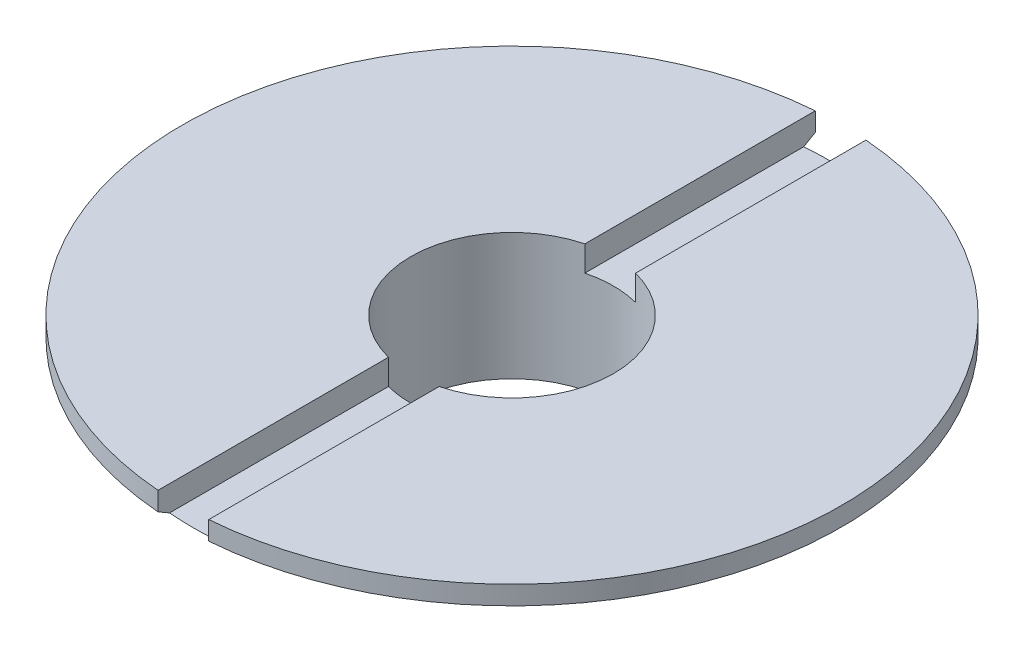
ISO-10303-21;
HEADER;
FILE_DESCRIPTION(('STEP AP214'),'2;1');
FILE_NAME('part.step','',(''),(''),'','','');
FILE_SCHEMA(('AUTOMOTIVE_DESIGN { 1 0 10303 214 1 1 1 1 }'));
ENDSEC;
DATA;
#1=APPLICATION_CONTEXT('core data for automotive mechanical design processes');
#2=APPLICATION_PROTOCOL_DEFINITION('international standard','automotive_design',2000,#1);
#3=PRODUCT_CONTEXT('',#1,'mechanical');
#4=PRODUCT('Part','Part','',(#3));
#5=PRODUCT_RELATED_PRODUCT_CATEGORY('part','',(#4));
#6=PRODUCT_DEFINITION_FORMATION('','',#4);
#7=PRODUCT_DEFINITION_CONTEXT('part definition',#1,'design');
#8=PRODUCT_DEFINITION('design','',#6,#7);
#9=PRODUCT_DEFINITION_SHAPE('','',#8);
#10=(LENGTH_UNIT() NAMED_UNIT(*) SI_UNIT(.MILLI.,.METRE.));
#11=(NAMED_UNIT(*) PLANE_ANGLE_UNIT() SI_UNIT($,.RADIAN.));
#12=(NAMED_UNIT(*) SI_UNIT($,.STERADIAN.) SOLID_ANGLE_UNIT());
#13=UNCERTAINTY_MEASURE_WITH_UNIT(LENGTH_MEASURE(1.E-05),#10,'distance_accuracy_value','');
#14=(GEOMETRIC_REPRESENTATION_CONTEXT(3) GLOBAL_UNCERTAINTY_ASSIGNED_CONTEXT((#13)) GLOBAL_UNIT_ASSIGNED_CONTEXT((#10,
#11,#12)) REPRESENTATION_CONTEXT('',''));
#15=CARTESIAN_POINT('',(0.,0.,0.));
#16=DIRECTION('',(0.,0.,1.));
#17=DIRECTION('',(1.,0.,0.));
#18=AXIS2_PLACEMENT_3D('',#15,#16,#17);
#19=CARTESIAN_POINT('',(0.,1.76121356458863,0.));
#20=DIRECTION('',(0.,1.,0.));
#21=DIRECTION('',(0.,0.,1.));
#22=AXIS2_PLACEMENT_3D('',#19,#20,#21);
#23=CONICAL_SURFACE('',#22,13.,1.0471975511966);
#24=CARTESIAN_POINT('',(0.,-2.5,0.));
#25=DIRECTION('',(0.,1.,0.));
#26=DIRECTION('',(0.,0.,1.));
#27=AXIS2_PLACEMENT_3D('',#24,#25,#26);
#28=CIRCLE('',#27,5.61936160423082);
#29=CARTESIAN_POINT('',(0.,-2.5,5.61936160423082));
#30=VERTEX_POINT('',#29);
#31=EDGE_CURVE('E207',#30,#30,#28,.T.);
#32=ORIENTED_EDGE('',*,*,#31,.T.);
#33=EDGE_LOOP('',(#32));
#34=FACE_BOUND('',#33,.T.);
#35=CARTESIAN_POINT('',(0.,1.76121356458863,0.));
#36=DIRECTION('',(0.,1.,0.));
#37=DIRECTION('',(0.,0.,1.));
#38=AXIS2_PLACEMENT_3D('',#35,#36,#37);
#39=CIRCLE('',#38,13.);
#40=CARTESIAN_POINT('',(-0.999999999999997,1.76121356458863,-12.9614813968157));
#41=VERTEX_POINT('',#40);
#42=CARTESIAN_POINT('',(-0.999999999999997,1.76121356458863,12.9614813968157));
#43=VERTEX_POINT('',#42);
#44=EDGE_CURVE('E129',#41,#43,#39,.T.);
#45=ORIENTED_EDGE('',*,*,#44,.F.);
#46=CARTESIAN_POINT('',(-0.999999999999998,1.76191356458863,-12.9626974351289));
#47=CARTESIAN_POINT('',(-0.999999999999998,1.44654310007895,-12.414807614886));
#48=CARTESIAN_POINT('',(-0.999999999999998,1.1312381940923,-11.866879939586));
#49=CARTESIAN_POINT('',(-0.999999999999998,0.500898113642046,-10.7708640181103));
#50=CARTESIAN_POINT('',(-0.999999999999998,0.185862941215046,-10.2227757707634));
#51=CARTESIAN_POINT('',(-0.999999999999998,-0.44410346208642,-9.12582376043192));
#52=CARTESIAN_POINT('',(-0.999999999999998,-0.759034287167687,-8.57695976439502));
#53=CARTESIAN_POINT('',(-0.999999999999998,-1.38818931101753,-7.47883096105241));
#54=CARTESIAN_POINT('',(-0.999999999999998,-1.70241351414487,-6.92956615624689));
#55=CARTESIAN_POINT('',(-0.999999999999998,-2.17157653462951,-6.10701575677405));
#56=CARTESIAN_POINT('',(-0.999999999999998,-2.32704791066362,-5.83403400401745));
#57=CARTESIAN_POINT('',(-0.999999999999998,-2.63746138525596,-5.28776463786228));
#58=CARTESIAN_POINT('',(-0.999999999999998,-2.79240347676807,-5.01447702045567));
#59=CARTESIAN_POINT('',(-0.999999999999998,-3.10135974518407,-4.46757322698629));
#60=CARTESIAN_POINT('',(-0.999999999999998,-3.25537437987272,-4.19395730958987));
#61=CARTESIAN_POINT('',(-0.999999999999998,-3.56197663448593,-3.6459368107344));
#62=CARTESIAN_POINT('',(-0.999999999999998,-3.71456430605616,-3.37153225829181));
#63=CARTESIAN_POINT('',(-0.999999999999998,-3.94180986880993,-2.9578886951189));
#64=CARTESIAN_POINT('',(-0.999999999999998,-4.01752089110942,-2.81922937173839));
#65=CARTESIAN_POINT('',(-0.999999999999998,-4.1678593257431,-2.54130845518419));
#66=CARTESIAN_POINT('',(-0.999999999999998,-4.24248664458464,-2.40204681137681));
#67=CARTESIAN_POINT('',(-0.999999999999998,-4.39015682099838,-2.12242354390389));
#68=CARTESIAN_POINT('',(-0.999999999999998,-4.46319725349592,-1.98206062943476));
#69=CARTESIAN_POINT('',(-0.999999999999998,-4.57056355858367,-1.77041367874698));
#70=CARTESIAN_POINT('',(-0.999999999999998,-4.60598411971819,-1.6996860889626));
#71=CARTESIAN_POINT('',(-0.999999999999998,-4.67582572921966,-1.55774017512345));
#72=CARTESIAN_POINT('',(-0.999999999999998,-4.71024681009839,-1.48652186712455));
#73=CARTESIAN_POINT('',(-0.999999999999998,-4.77877812281097,-1.3411735748486));
#74=CARTESIAN_POINT('',(-0.999999999999998,-4.81284421110772,-1.26702266489727));
#75=CARTESIAN_POINT('',(-0.999999999999998,-4.8788640014603,-1.11778789583251));
#76=CARTESIAN_POINT('',(-0.999999999999998,-4.91081796930764,-1.04270415552555));
#77=CARTESIAN_POINT('',(-0.999999999999998,-4.97157784464729,-0.891318955786635));
#78=CARTESIAN_POINT('',(-0.999999999999998,-5.00038592357764,-0.815018378498337));
#79=CARTESIAN_POINT('',(-0.999999999999998,-5.05326150855774,-0.660771002910725));
#80=CARTESIAN_POINT('',(-0.999999999999998,-5.07733102251874,-0.5828249174462));
#81=CARTESIAN_POINT('',(-0.999999999999998,-5.1120303985729,-0.44924271365831));
#82=CARTESIAN_POINT('',(-0.999999999999998,-5.12451804328225,-0.394097319444673));
#83=CARTESIAN_POINT('',(-0.999999999999998,-5.1450827387689,-0.283000512325802));
#84=CARTESIAN_POINT('',(-0.999999999999998,-5.15316254432022,-0.227049625326817));
#85=CARTESIAN_POINT('',(-0.999999999999998,-5.16405335239172,-0.114979260207174));
#86=CARTESIAN_POINT('',(-0.999999999999998,-5.16689764152065,-0.058863135235543));
#87=CARTESIAN_POINT('',(-0.999999999999998,-5.16707734656735,0.0533775683846901));
#88=CARTESIAN_POINT('',(-0.999999999999998,-5.16441258186698,0.109502147250135));
#89=CARTESIAN_POINT('',(-0.999999999999998,-5.15228985834141,0.238159640703518));
#90=CARTESIAN_POINT('',(-0.999999999999998,-5.14102057671114,0.310519567636525));
#91=CARTESIAN_POINT('',(-0.999999999999998,-5.11151068170504,0.453803824231379));
#92=CARTESIAN_POINT('',(-0.999999999999998,-5.09326270382424,0.52472655370254));
#93=CARTESIAN_POINT('',(-0.999999999999998,-5.05155846392108,0.666016663517311));
#94=CARTESIAN_POINT('',(-0.999999999999998,-5.0280358236357,0.736363938081781));
#95=CARTESIAN_POINT('',(-0.999999999999998,-4.99015336519638,0.840905149310635));
#96=CARTESIAN_POINT('',(-0.999999999999998,-4.97709495028742,0.875583806236056));
#97=CARTESIAN_POINT('',(-0.999999999999998,-4.95025199633135,0.944658345481751));
#98=CARTESIAN_POINT('',(-0.999999999999998,-4.93646748155324,0.979054237208741));
#99=CARTESIAN_POINT('',(-0.999999999999998,-4.89103335841835,1.08962502872005));
#100=CARTESIAN_POINT('',(-0.999999999999998,-4.85820310833388,1.16531390215794));
#101=CARTESIAN_POINT('',(-0.999999999999998,-4.79055508237912,1.3158018452918));
#102=CARTESIAN_POINT('',(-0.999999999999998,-4.75573696889086,1.39060076121529));
#103=CARTESIAN_POINT('',(-0.999999999999998,-4.68469861279711,1.53957226961997));
#104=CARTESIAN_POINT('',(-0.999999999999998,-4.64847769399958,1.61374453851728));
#105=CARTESIAN_POINT('',(-0.999999999999998,-4.57503758985759,1.76159423012742));
#106=CARTESIAN_POINT('',(-0.999999999999998,-4.53781837090288,1.83527163607476));
#107=CARTESIAN_POINT('',(-0.999999999999998,-4.42496493703241,2.05595962422562));
#108=CARTESIAN_POINT('',(-0.999999999999998,-4.348239495152,2.20241116883192));
#109=CARTESIAN_POINT('',(-0.999999999999998,-4.19313689637219,2.49437426533894));
#110=CARTESIAN_POINT('',(-0.999999999999998,-4.11476023762732,2.63988608391489));
#111=CARTESIAN_POINT('',(-0.999999999999998,-3.95740555537634,2.92946804358907));
#112=CARTESIAN_POINT('',(-0.999999999999998,-3.87843384514201,3.07354161857863));
#113=CARTESIAN_POINT('',(-0.999999999999998,-3.71977518266145,3.36130803884283));
#114=CARTESIAN_POINT('',(-0.999999999999998,-3.64008817600715,3.50500085406013));
#115=CARTESIAN_POINT('',(-0.999999999999998,-3.40043948947353,3.93540796407278));
#116=CARTESIAN_POINT('',(-0.999999999999998,-3.23974580025044,4.22171436895267));
#117=CARTESIAN_POINT('',(-0.999999999999998,-2.87980524727489,4.86029040992734));
#118=CARTESIAN_POINT('',(-0.999999999999998,-2.68028804415844,5.21240726454267));
#119=CARTESIAN_POINT('',(-0.999999999999998,-2.2803810118986,5.91614949498076));
#120=CARTESIAN_POINT('',(-0.999999999999998,-2.07999117381118,6.26777486571706));
#121=CARTESIAN_POINT('',(-0.999999999999998,-1.47790434710308,7.32247977240141));
#122=CARTESIAN_POINT('',(-0.999999999999998,-1.07544114288528,8.02512162427379));
#123=CARTESIAN_POINT('',(-0.999999999999998,-0.26735489041489,9.4338838609302));
#124=CARTESIAN_POINT('',(-0.999999999999998,0.138273137180841,10.1400013855152));
#125=CARTESIAN_POINT('',(-0.999999999999998,0.74700379506642,11.1988245013859));
#126=CARTESIAN_POINT('',(-0.999999999999998,0.949921609001419,11.5516363322112));
#127=CARTESIAN_POINT('',(-0.999999999999998,1.3558527360151,12.2572044890082));
#128=CARTESIAN_POINT('',(-0.999999999999998,1.55886604897889,12.609960815046));
#129=CARTESIAN_POINT('',(-0.999999999999998,1.76191356458863,12.9626974351289));
#130=B_SPLINE_CURVE_WITH_KNOTS('',3,(#46,#47,#48,#49,#50,#51,#52,#53,#54,#55,#56,#57,#58,#59,
#60,#61,#62,#63,#64,#65,#66,#67,#68,#69,#70,#71,#72,#73,#74,#75,#76,#77,#78,#79,#80,#81,#82,#83,
#84,#85,#86,#87,#88,#89,#90,#91,#92,#93,#94,#95,#96,#97,#98,#99,#100,#101,#102,#103,#104,#105,
#106,#107,#108,#109,#110,#111,#112,#113,#114,#115,#116,#117,#118,#119,#120,#121,#122,#123,#124,
#125,#126,#127,#128,#129),.UNSPECIFIED.,.F.,.F.,(4,2,2,2,2,2,2,2,2,2,2,2,2,2,2,2,2,2,2,2,2,2,2,
2,2,2,2,2,2,2,2,2,2,2,2,2,2,2,2,2,2,4),(0.,1.8965169911609,3.7930481777101,5.69144156529121,
7.58982321044377,8.53227368369345,9.47473665485307,10.4166883503678,11.3586058211071,
11.832550775353,12.3065363774576,12.7812015423138,13.0184997906557,13.2557903113274,
13.500574362,13.7453275499085,13.989910715525,14.2343900177659,14.4038760054109,
14.5732559474352,14.7415552280821,14.9098600266249,15.1290843102431,15.3485405789206,
15.5709312315697,15.6820932033614,15.793251462054,16.0407092034743,16.2882090987786,
16.5358298183084,16.7834588850946,17.2794335648072,17.775260698294,18.2681504695154,
18.7610780549148,19.7460320573869,20.9601722198616,22.1743248560179,24.6035491283084,
27.0465440270853,28.2675544236191,29.4885633550206),.UNSPECIFIED.);
#131=CARTESIAN_POINT('',(-0.999999999999998,1.5,-12.5076529883164));
#132=VERTEX_POINT('',#131);
#133=EDGE_CURVE('E121',#41,#132,#130,.T.);
#134=ORIENTED_EDGE('',*,*,#133,.T.);
#135=CARTESIAN_POINT('',(0.,1.5,0.));
#136=DIRECTION('',(0.,1.,0.));
#137=DIRECTION('',(0.,0.,1.));
#138=AXIS2_PLACEMENT_3D('',#135,#136,#137);
#139=CIRCLE('',#138,12.5475648345063);
#140=CARTESIAN_POINT('',(1.,1.5,-12.5076529883164));
#141=VERTEX_POINT('',#140);
#142=EDGE_CURVE('E109',#132,#141,#139,.F.);
#143=ORIENTED_EDGE('',*,*,#142,.T.);
#144=CARTESIAN_POINT('',(1.,1.76191356458863,-12.9626974351289));
#145=CARTESIAN_POINT('',(1.,1.44654310007895,-12.414807614886));
#146=CARTESIAN_POINT('',(1.,1.1312381940923,-11.866879939586));
#147=CARTESIAN_POINT('',(1.,0.500898113642047,-10.7708640181103));
#148=CARTESIAN_POINT('',(1.,0.185862941215046,-10.2227757707634));
#149=CARTESIAN_POINT('',(1.,-0.444103462086419,-9.12582376043192));
#150=CARTESIAN_POINT('',(1.,-0.759034287167686,-8.57695976439503));
#151=CARTESIAN_POINT('',(1.,-1.38818931101753,-7.47883096105241));
#152=CARTESIAN_POINT('',(1.,-1.70241351414487,-6.92956615624689));
#153=CARTESIAN_POINT('',(1.,-2.17157653462951,-6.10701575677405));
#154=CARTESIAN_POINT('',(1.,-2.32704791066362,-5.83403400401746));
#155=CARTESIAN_POINT('',(1.,-2.63746138525596,-5.28776463786228));
#156=CARTESIAN_POINT('',(1.,-2.79240347676807,-5.01447702045567));
#157=CARTESIAN_POINT('',(1.,-3.10135974518407,-4.46757322698629));
#158=CARTESIAN_POINT('',(1.,-3.25537437987273,-4.19395730958987));
#159=CARTESIAN_POINT('',(1.,-3.56197663448593,-3.6459368107344));
#160=CARTESIAN_POINT('',(1.,-3.71456430605616,-3.37153225829181));
#161=CARTESIAN_POINT('',(1.,-3.94180986880993,-2.9578886951189));
#162=CARTESIAN_POINT('',(1.,-4.01752089110942,-2.81922937173839));
#163=CARTESIAN_POINT('',(1.,-4.1678593257431,-2.54130845518419));
#164=CARTESIAN_POINT('',(1.,-4.24248664458464,-2.40204681137681));
#165=CARTESIAN_POINT('',(1.,-4.39015682099838,-2.12242354390389));
#166=CARTESIAN_POINT('',(1.,-4.46319725349592,-1.98206062943476));
#167=CARTESIAN_POINT('',(1.,-4.57056355858366,-1.77041367874698));
#168=CARTESIAN_POINT('',(1.,-4.60598411971819,-1.6996860889626));
#169=CARTESIAN_POINT('',(1.,-4.67582572921966,-1.55774017512345));
#170=CARTESIAN_POINT('',(1.,-4.71024681009839,-1.48652186712455));
#171=CARTESIAN_POINT('',(1.,-4.77877812281096,-1.3411735748486));
#172=CARTESIAN_POINT('',(1.,-4.81284421110772,-1.26702266489727));
#173=CARTESIAN_POINT('',(1.,-4.8788640014603,-1.11778789583251));
#174=CARTESIAN_POINT('',(1.,-4.91081796930764,-1.04270415552555));
#175=CARTESIAN_POINT('',(1.,-4.97157784464728,-0.891318955786634));
#176=CARTESIAN_POINT('',(1.,-5.00038592357764,-0.815018378498335));
#177=CARTESIAN_POINT('',(1.,-5.05326150855774,-0.660771002910723));
#178=CARTESIAN_POINT('',(1.,-5.07733102251873,-0.582824917446198));
#179=CARTESIAN_POINT('',(1.,-5.1120303985729,-0.449242713658308));
#180=CARTESIAN_POINT('',(1.,-5.12451804328225,-0.394097319444671));
#181=CARTESIAN_POINT('',(1.,-5.1450827387689,-0.283000512325799));
#182=CARTESIAN_POINT('',(1.,-5.15316254432022,-0.227049625326813));
#183=CARTESIAN_POINT('',(1.,-5.16405335239171,-0.11497926020717));
#184=CARTESIAN_POINT('',(1.,-5.16689764152064,-0.0588631352355393));
#185=CARTESIAN_POINT('',(1.,-5.16707734656734,0.0533775683846945));
#186=CARTESIAN_POINT('',(1.,-5.16441258186698,0.10950214725014));
#187=CARTESIAN_POINT('',(1.,-5.15228985834141,0.238159640703524));
#188=CARTESIAN_POINT('',(1.,-5.14102057671114,0.310519567636532));
#189=CARTESIAN_POINT('',(1.,-5.11151068170504,0.453803824231387));
#190=CARTESIAN_POINT('',(1.,-5.09326270382424,0.524726553702548));
#191=CARTESIAN_POINT('',(1.,-5.05155846392107,0.66601666351732));
#192=CARTESIAN_POINT('',(1.,-5.0280358236357,0.736363938081791));
#193=CARTESIAN_POINT('',(1.,-4.99015336519637,0.840905149310646));
#194=CARTESIAN_POINT('',(1.,-4.97709495028741,0.875583806236067));
#195=CARTESIAN_POINT('',(1.,-4.95025199633135,0.944658345481764));
#196=CARTESIAN_POINT('',(1.,-4.93646748155324,0.979054237208754));
#197=CARTESIAN_POINT('',(1.,-4.89103335841834,1.08962502872006));
#198=CARTESIAN_POINT('',(1.,-4.85820310833387,1.16531390215795));
#199=CARTESIAN_POINT('',(1.,-4.79055508237911,1.31580184529182));
#200=CARTESIAN_POINT('',(1.,-4.75573696889085,1.39060076121531));
#201=CARTESIAN_POINT('',(1.,-4.6846986127971,1.53957226961999));
#202=CARTESIAN_POINT('',(1.,-4.64847769399957,1.61374453851731));
#203=CARTESIAN_POINT('',(1.,-4.57503758985758,1.76159423012744));
#204=CARTESIAN_POINT('',(1.,-4.53781837090287,1.83527163607479));
#205=CARTESIAN_POINT('',(1.,-4.4249649370324,2.05595962422565));
#206=CARTESIAN_POINT('',(1.,-4.34823949515198,2.20241116883195));
#207=CARTESIAN_POINT('',(1.,-4.19313689637217,2.49437426533898));
#208=CARTESIAN_POINT('',(1.,-4.1147602376273,2.63988608391492));
#209=CARTESIAN_POINT('',(1.,-3.95740555537632,2.92946804358911));
#210=CARTESIAN_POINT('',(1.,-3.87843384514199,3.07354161857867));
#211=CARTESIAN_POINT('',(1.,-3.71977518266143,3.36130803884287));
#212=CARTESIAN_POINT('',(1.,-3.64008817600712,3.50500085406018));
#213=CARTESIAN_POINT('',(1.,-3.40043948947349,3.93540796407284));
#214=CARTESIAN_POINT('',(1.,-3.2397458002504,4.22171436895272));
#215=CARTESIAN_POINT('',(1.,-2.87980524727486,4.8602904099274));
#216=CARTESIAN_POINT('',(1.,-2.68028804415841,5.21240726454273));
#217=CARTESIAN_POINT('',(1.,-2.28038101189857,5.91614949498081));
#218=CARTESIAN_POINT('',(1.,-2.07999117381115,6.26777486571711));
#219=CARTESIAN_POINT('',(1.,-1.47790434710306,7.32247977240146));
#220=CARTESIAN_POINT('',(1.,-1.07544114288526,8.02512162427383));
#221=CARTESIAN_POINT('',(1.,-0.267354890414874,9.43388386093022));
#222=CARTESIAN_POINT('',(1.,0.138273137180853,10.1400013855152));
#223=CARTESIAN_POINT('',(1.,0.747003795066426,11.1988245013859));
#224=CARTESIAN_POINT('',(1.,0.949921609001423,11.5516363322112));
#225=CARTESIAN_POINT('',(1.,1.3558527360151,12.2572044890082));
#226=CARTESIAN_POINT('',(1.,1.55886604897889,12.609960815046));
#227=CARTESIAN_POINT('',(1.,1.76191356458863,12.9626974351289));
#228=B_SPLINE_CURVE_WITH_KNOTS('',3,(#144,#145,#146,#147,#148,#149,#150,#151,#152,#153,#154,
#155,#156,#157,#158,#159,#160,#161,#162,#163,#164,#165,#166,#167,#168,#169,#170,#171,#172,#173,
#174,#175,#176,#177,#178,#179,#180,#181,#182,#183,#184,#185,#186,#187,#188,#189,#190,#191,#192,
#193,#194,#195,#196,#197,#198,#199,#200,#201,#202,#203,#204,#205,#206,#207,#208,#209,#210,#211,
#212,#213,#214,#215,#216,#217,#218,#219,#220,#221,#222,#223,#224,#225,#226,#227),.UNSPECIFIED.,
.F.,.F.,(4,2,2,2,2,2,2,2,2,2,2,2,2,2,2,2,2,2,2,2,2,2,2,2,2,2,2,2,2,2,2,2,2,2,2,2,2,2,2,2,2,4),
(0.,1.8965169911609,3.7930481777101,5.69144156529121,7.58982321044377,8.53227368369345,
9.47473665485307,10.4166883503678,11.3586058211071,11.832550775353,12.3065363774576,
12.7812015423138,13.0184997906557,13.2557903113274,13.500574362,13.7453275499085,
13.989910715525,14.2343900177659,14.4038760054109,14.5732559474352,14.7415552280821,
14.9098600266249,15.1290843102432,15.3485405789206,15.5709312315697,15.6820932033615,
15.793251462054,16.0407092034743,16.2882090987786,16.5358298183084,16.7834588850946,
17.2794335648072,17.7752606982941,18.2681504695155,18.7610780549148,19.746032057387,
20.9601722198616,22.174324856018,24.6035491283085,27.0465440270853,28.2675544236191,
29.4885633550206),.UNSPECIFIED.);
#229=CARTESIAN_POINT('',(1.,1.76121356458863,-12.9614813968157));
#230=VERTEX_POINT('',#229);
#231=EDGE_CURVE('E155',#230,#141,#228,.T.);
#232=ORIENTED_EDGE('',*,*,#231,.F.);
#233=CARTESIAN_POINT('',(1.,1.76121356458863,12.9614813968157));
#234=VERTEX_POINT('',#233);
#235=EDGE_CURVE('E210',#234,#230,#39,.T.);
#236=ORIENTED_EDGE('',*,*,#235,.F.);
#237=CARTESIAN_POINT('',(1.,1.5,12.5076529883164));
#238=VERTEX_POINT('',#237);
#239=EDGE_CURVE('E160',#238,#234,#228,.T.);
#240=ORIENTED_EDGE('',*,*,#239,.F.);
#241=CARTESIAN_POINT('',(-0.999999999999998,1.5,12.5076529883164));
#242=VERTEX_POINT('',#241);
#243=EDGE_CURVE('E117',#238,#242,#139,.F.);
#244=ORIENTED_EDGE('',*,*,#243,.T.);
#245=EDGE_CURVE('E133',#242,#43,#130,.T.);
#246=ORIENTED_EDGE('',*,*,#245,.T.);
#247=EDGE_LOOP('',(#45,#134,#143,#232,#236,#240,#244,#246));
#248=FACE_BOUND('',#247,.T.);
#249=ADVANCED_FACE('F33',(#34,#248),#23,.T.);
#250=CARTESIAN_POINT('',(0.,36.09806212048,0.));
#251=DIRECTION('',(0.,1.,0.));
#252=DIRECTION('',(0.,0.,1.));
#253=AXIS2_PLACEMENT_3D('',#250,#251,#252);
#254=CYLINDRICAL_SURFACE('',#253,13.);
#255=CARTESIAN_POINT('',(0.,2.5,0.));
#256=DIRECTION('',(0.,1.,0.));
#257=DIRECTION('',(0.,0.,1.));
#258=AXIS2_PLACEMENT_3D('',#255,#256,#257);
#259=CIRCLE('',#258,13.);
#260=CARTESIAN_POINT('',(-0.999999999999998,2.5,-12.9614813968157));
#261=VERTEX_POINT('',#260);
#262=CARTESIAN_POINT('',(-0.999999999999998,2.5,12.9614813968157));
#263=VERTEX_POINT('',#262);
#264=EDGE_CURVE('E239',#261,#263,#259,.T.);
#265=ORIENTED_EDGE('',*,*,#264,.F.);
#266=DIRECTION('',(0.,1.,0.));
#267=VECTOR('',#266,1.);
#268=CARTESIAN_POINT('',(-0.999999999999997,36.09806212048,-12.9614813968157));
#269=LINE('',#268,#267);
#270=EDGE_CURVE('E131',#261,#41,#269,.F.);
#271=ORIENTED_EDGE('',*,*,#270,.T.);
#272=ORIENTED_EDGE('',*,*,#44,.T.);
#273=DIRECTION('',(0.,1.,0.));
#274=VECTOR('',#273,1.);
#275=CARTESIAN_POINT('',(-0.999999999999997,36.09806212048,12.9614813968157));
#276=LINE('',#275,#274);
#277=EDGE_CURVE('E145',#43,#263,#276,.T.);
#278=ORIENTED_EDGE('',*,*,#277,.T.);
#279=EDGE_LOOP('',(#265,#271,#272,#278));
#280=FACE_BOUND('',#279,.T.);
#281=ADVANCED_FACE('F194',(#280),#254,.T.);
#282=CARTESIAN_POINT('',(0.,2.5,13.));
#283=DIRECTION('',(0.,1.,0.));
#284=DIRECTION('',(0.,0.,1.));
#285=AXIS2_PLACEMENT_3D('',#282,#283,#284);
#286=PLANE('',#285);
#287=ORIENTED_EDGE('',*,*,#264,.T.);
#288=DIRECTION('',(0.,0.,-1.));
#289=VECTOR('',#288,1.);
#290=CARTESIAN_POINT('',(-0.999999999999998,2.5,13.));
#291=LINE('',#290,#289);
#292=CARTESIAN_POINT('',(-0.999999999999997,2.5,3.87298334620741));
#293=VERTEX_POINT('',#292);
#294=EDGE_CURVE('E149',#263,#293,#291,.T.);
#295=ORIENTED_EDGE('',*,*,#294,.T.);
#296=CARTESIAN_POINT('',(0.,2.5,0.));
#297=DIRECTION('',(0.,1.,0.));
#298=DIRECTION('',(0.,0.,1.));
#299=AXIS2_PLACEMENT_3D('',#296,#297,#298);
#300=CIRCLE('',#299,4.);
#301=CARTESIAN_POINT('',(-0.999999999999997,2.5,-3.87298334620741));
#302=VERTEX_POINT('',#301);
#303=EDGE_CURVE('E135',#302,#293,#300,.T.);
#304=ORIENTED_EDGE('',*,*,#303,.F.);
#305=EDGE_CURVE('E137',#302,#261,#291,.T.);
#306=ORIENTED_EDGE('',*,*,#305,.T.);
#307=EDGE_LOOP('',(#287,#295,#304,#306));
#308=FACE_BOUND('',#307,.T.);
#309=ADVANCED_FACE('F186',(#308),#286,.T.);
#310=CARTESIAN_POINT('',(0.,36.09806212048,0.));
#311=DIRECTION('',(0.,1.,0.));
#312=DIRECTION('',(0.,0.,1.));
#313=AXIS2_PLACEMENT_3D('',#310,#311,#312);
#314=CYLINDRICAL_SURFACE('',#313,4.);
#315=CARTESIAN_POINT('',(0.,-2.5,0.));
#316=DIRECTION('',(0.,1.,0.));
#317=DIRECTION('',(0.,0.,1.));
#318=AXIS2_PLACEMENT_3D('',#315,#316,#317);
#319=CIRCLE('',#318,4.);
#320=CARTESIAN_POINT('',(0.,-2.5,4.));
#321=VERTEX_POINT('',#320);
#322=EDGE_CURVE('E130',#321,#321,#319,.T.);
#323=ORIENTED_EDGE('',*,*,#322,.F.);
#324=EDGE_LOOP('',(#323));
#325=FACE_BOUND('',#324,.T.);
#326=CARTESIAN_POINT('',(0.,1.5,0.));
#327=DIRECTION('',(0.,1.,0.));
#328=DIRECTION('',(0.,0.,1.));
#329=AXIS2_PLACEMENT_3D('',#326,#327,#328);
#330=CIRCLE('',#329,4.);
#331=CARTESIAN_POINT('',(1.,1.5,-3.87298334620741));
#332=VERTEX_POINT('',#331);
#333=CARTESIAN_POINT('',(-0.999999999999998,1.5,-3.87298334620741));
#334=VERTEX_POINT('',#333);
#335=EDGE_CURVE('E215',#332,#334,#330,.T.);
#336=ORIENTED_EDGE('',*,*,#335,.T.);
#337=DIRECTION('',(0.,1.,0.));
#338=VECTOR('',#337,1.);
#339=CARTESIAN_POINT('',(-0.999999999999997,36.09806212048,-3.87298334620741));
#340=LINE('',#339,#338);
#341=EDGE_CURVE('E11',#334,#302,#340,.T.);
#342=ORIENTED_EDGE('',*,*,#341,.T.);
#343=ORIENTED_EDGE('',*,*,#303,.T.);
#344=DIRECTION('',(0.,1.,0.));
#345=VECTOR('',#344,1.);
#346=CARTESIAN_POINT('',(-0.999999999999997,36.09806212048,3.87298334620741));
#347=LINE('',#346,#345);
#348=CARTESIAN_POINT('',(-0.999999999999998,1.5,3.87298334620741));
#349=VERTEX_POINT('',#348);
#350=EDGE_CURVE('E221',#293,#349,#347,.F.);
#351=ORIENTED_EDGE('',*,*,#350,.T.);
#352=CARTESIAN_POINT('',(1.,1.5,3.87298334620741));
#353=VERTEX_POINT('',#352);
#354=EDGE_CURVE('E209',#349,#353,#330,.T.);
#355=ORIENTED_EDGE('',*,*,#354,.T.);
#356=DIRECTION('',(0.,1.,0.));
#357=VECTOR('',#356,1.);
#358=CARTESIAN_POINT('',(1.,36.09806212048,3.87298334620741));
#359=LINE('',#358,#357);
#360=CARTESIAN_POINT('',(1.,2.5,3.87298334620741));
#361=VERTEX_POINT('',#360);
#362=EDGE_CURVE('E213',#361,#353,#359,.F.);
#363=ORIENTED_EDGE('',*,*,#362,.F.);
#364=CARTESIAN_POINT('',(1.,2.5,-3.87298334620741));
#365=VERTEX_POINT('',#364);
#366=EDGE_CURVE('E240',#361,#365,#300,.T.);
#367=ORIENTED_EDGE('',*,*,#366,.T.);
#368=DIRECTION('',(0.,1.,0.));
#369=VECTOR('',#368,1.);
#370=CARTESIAN_POINT('',(1.,36.09806212048,-3.87298334620741));
#371=LINE('',#370,#369);
#372=EDGE_CURVE('E41',#332,#365,#371,.T.);
#373=ORIENTED_EDGE('',*,*,#372,.F.);
#374=EDGE_LOOP('',(#336,#342,#343,#351,#355,#363,#367,#373));
#375=FACE_BOUND('',#374,.T.);
#376=ADVANCED_FACE('F183',(#325,#375),#314,.F.);
#377=CARTESIAN_POINT('',(0.,-2.5,5.61936160423082));
#378=DIRECTION('',(0.,-1.,0.));
#379=DIRECTION('',(0.,0.,-1.));
#380=AXIS2_PLACEMENT_3D('',#377,#378,#379);
#381=PLANE('',#380);
#382=ORIENTED_EDGE('',*,*,#322,.T.);
#383=EDGE_LOOP('',(#382));
#384=FACE_BOUND('',#383,.T.);
#385=ORIENTED_EDGE('',*,*,#31,.F.);
#386=EDGE_LOOP('',(#385));
#387=FACE_BOUND('',#386,.T.);
#388=ADVANCED_FACE('F35',(#384,#387),#381,.T.);
#389=DIRECTION('',(0.,1.,0.));
#390=VECTOR('',#389,1.);
#391=CARTESIAN_POINT('',(1.,36.09806212048,-12.9614813968157));
#392=LINE('',#391,#390);
#393=CARTESIAN_POINT('',(1.,2.5,-12.9614813968157));
#394=VERTEX_POINT('',#393);
#395=EDGE_CURVE('E157',#394,#230,#392,.F.);
#396=ORIENTED_EDGE('',*,*,#395,.F.);
#397=CARTESIAN_POINT('',(1.,2.5,12.9614813968157));
#398=VERTEX_POINT('',#397);
#399=EDGE_CURVE('E237',#398,#394,#259,.T.);
#400=ORIENTED_EDGE('',*,*,#399,.F.);
#401=DIRECTION('',(0.,1.,0.));
#402=VECTOR('',#401,1.);
#403=CARTESIAN_POINT('',(1.,36.09806212048,12.9614813968157));
#404=LINE('',#403,#402);
#405=EDGE_CURVE('E167',#234,#398,#404,.T.);
#406=ORIENTED_EDGE('',*,*,#405,.F.);
#407=ORIENTED_EDGE('',*,*,#235,.T.);
#408=EDGE_LOOP('',(#396,#400,#406,#407));
#409=FACE_BOUND('',#408,.T.);
#410=ADVANCED_FACE('F190',(#409),#254,.T.);
#411=DIRECTION('',(0.,0.,-1.));
#412=VECTOR('',#411,1.);
#413=CARTESIAN_POINT('',(1.,2.5,13.));
#414=LINE('',#413,#412);
#415=EDGE_CURVE('E116',#398,#361,#414,.T.);
#416=ORIENTED_EDGE('',*,*,#415,.F.);
#417=ORIENTED_EDGE('',*,*,#399,.T.);
#418=EDGE_CURVE('E159',#365,#394,#414,.T.);
#419=ORIENTED_EDGE('',*,*,#418,.F.);
#420=ORIENTED_EDGE('',*,*,#366,.F.);
#421=EDGE_LOOP('',(#416,#417,#419,#420));
#422=FACE_BOUND('',#421,.T.);
#423=ADVANCED_FACE('F188',(#422),#286,.T.);
#424=CARTESIAN_POINT('',(0.,1.5,0.));
#425=DIRECTION('',(0.,1.,0.));
#426=DIRECTION('',(1.,0.,0.));
#427=AXIS2_PLACEMENT_3D('',#424,#425,#426);
#428=PLANE('',#427);
#429=DIRECTION('',(0.,0.,-1.));
#430=VECTOR('',#429,1.);
#431=CARTESIAN_POINT('',(1.,1.5,-13.));
#432=LINE('',#431,#430);
#433=EDGE_CURVE('E56',#353,#238,#432,.F.);
#434=ORIENTED_EDGE('',*,*,#433,.F.);
#435=ORIENTED_EDGE('',*,*,#354,.F.);
#436=DIRECTION('',(0.,0.,-1.));
#437=VECTOR('',#436,1.);
#438=CARTESIAN_POINT('',(-0.999999999999998,1.5,-13.));
#439=LINE('',#438,#437);
#440=EDGE_CURVE('E124',#349,#242,#439,.F.);
#441=ORIENTED_EDGE('',*,*,#440,.T.);
#442=ORIENTED_EDGE('',*,*,#243,.F.);
#443=EDGE_LOOP('',(#434,#435,#441,#442));
#444=FACE_BOUND('',#443,.T.);
#445=ADVANCED_FACE('F176',(#444),#428,.T.);
#446=CARTESIAN_POINT('',(1.,2.500012,-13.));
#447=DIRECTION('',(1.,0.,0.));
#448=DIRECTION('',(0.,0.,-1.));
#449=AXIS2_PLACEMENT_3D('',#446,#447,#448);
#450=PLANE('',#449);
#451=ORIENTED_EDGE('',*,*,#239,.T.);
#452=ORIENTED_EDGE('',*,*,#405,.T.);
#453=ORIENTED_EDGE('',*,*,#415,.T.);
#454=ORIENTED_EDGE('',*,*,#362,.T.);
#455=ORIENTED_EDGE('',*,*,#433,.T.);
#456=EDGE_LOOP('',(#451,#452,#453,#454,#455));
#457=FACE_BOUND('',#456,.T.);
#458=ADVANCED_FACE('F171',(#457),#450,.F.);
#459=CARTESIAN_POINT('',(-0.999999999999998,2.500012,-13.));
#460=DIRECTION('',(1.,0.,0.));
#461=DIRECTION('',(0.,0.,-1.));
#462=AXIS2_PLACEMENT_3D('',#459,#460,#461);
#463=PLANE('',#462);
#464=ORIENTED_EDGE('',*,*,#440,.F.);
#465=ORIENTED_EDGE('',*,*,#350,.F.);
#466=ORIENTED_EDGE('',*,*,#294,.F.);
#467=ORIENTED_EDGE('',*,*,#277,.F.);
#468=ORIENTED_EDGE('',*,*,#245,.F.);
#469=EDGE_LOOP('',(#464,#465,#466,#467,#468));
#470=FACE_BOUND('',#469,.T.);
#471=ADVANCED_FACE('F175',(#470),#463,.T.);
#472=ORIENTED_EDGE('',*,*,#270,.F.);
#473=ORIENTED_EDGE('',*,*,#305,.F.);
#474=ORIENTED_EDGE('',*,*,#341,.F.);
#475=EDGE_CURVE('E48',#132,#334,#439,.F.);
#476=ORIENTED_EDGE('',*,*,#475,.F.);
#477=ORIENTED_EDGE('',*,*,#133,.F.);
#478=EDGE_LOOP('',(#472,#473,#474,#476,#477));
#479=FACE_BOUND('',#478,.T.);
#480=ADVANCED_FACE('F120',(#479),#463,.T.);
#481=ORIENTED_EDGE('',*,*,#231,.T.);
#482=EDGE_CURVE('E112',#141,#332,#432,.F.);
#483=ORIENTED_EDGE('',*,*,#482,.T.);
#484=ORIENTED_EDGE('',*,*,#372,.T.);
#485=ORIENTED_EDGE('',*,*,#418,.T.);
#486=ORIENTED_EDGE('',*,*,#395,.T.);
#487=EDGE_LOOP('',(#481,#483,#484,#485,#486));
#488=FACE_BOUND('',#487,.T.);
#489=ADVANCED_FACE('F178',(#488),#450,.F.);
#490=ORIENTED_EDGE('',*,*,#475,.T.);
#491=ORIENTED_EDGE('',*,*,#335,.F.);
#492=ORIENTED_EDGE('',*,*,#482,.F.);
#493=ORIENTED_EDGE('',*,*,#142,.F.);
#494=EDGE_LOOP('',(#490,#491,#492,#493));
#495=FACE_BOUND('',#494,.T.);
#496=ADVANCED_FACE('F110',(#495),#428,.T.);
#497=CLOSED_SHELL('',(#249,#281,#309,#376,#388,#410,#423,#445,#458,#471,#480,#489,#496));
#498=MANIFOLD_SOLID_BREP('B2',#497);
#499=ADVANCED_BREP_SHAPE_REPRESENTATION('',(#18,#498),#14);
#500=SHAPE_DEFINITION_REPRESENTATION(#9,#499);
ENDSEC;
END-ISO-10303-21;
